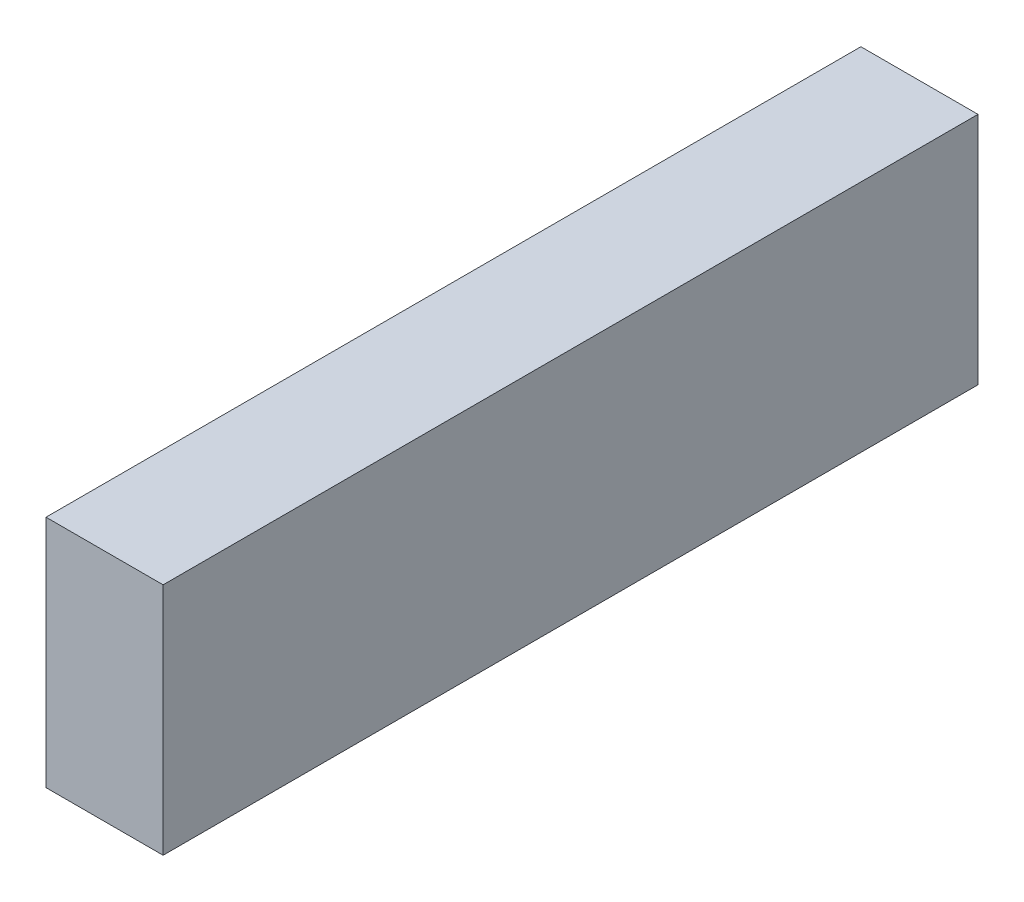
ISO-10303-21;
HEADER;
FILE_DESCRIPTION(('STEP AP214'),'2;1');
FILE_NAME('part.step','',(''),(''),'','','');
FILE_SCHEMA(('AUTOMOTIVE_DESIGN { 1 0 10303 214 1 1 1 1 }'));
ENDSEC;
DATA;
#1=APPLICATION_CONTEXT('core data for automotive mechanical design processes');
#2=APPLICATION_PROTOCOL_DEFINITION('international standard','automotive_design',2000,#1);
#3=PRODUCT_CONTEXT('',#1,'mechanical');
#4=PRODUCT('Part','Part','',(#3));
#5=PRODUCT_RELATED_PRODUCT_CATEGORY('part','',(#4));
#6=PRODUCT_DEFINITION_FORMATION('','',#4);
#7=PRODUCT_DEFINITION_CONTEXT('part definition',#1,'design');
#8=PRODUCT_DEFINITION('design','',#6,#7);
#9=PRODUCT_DEFINITION_SHAPE('','',#8);
#10=(LENGTH_UNIT() NAMED_UNIT(*) SI_UNIT(.MILLI.,.METRE.));
#11=(NAMED_UNIT(*) PLANE_ANGLE_UNIT() SI_UNIT($,.RADIAN.));
#12=(NAMED_UNIT(*) SI_UNIT($,.STERADIAN.) SOLID_ANGLE_UNIT());
#13=UNCERTAINTY_MEASURE_WITH_UNIT(LENGTH_MEASURE(1.E-05),#10,'distance_accuracy_value','');
#14=(GEOMETRIC_REPRESENTATION_CONTEXT(3) GLOBAL_UNCERTAINTY_ASSIGNED_CONTEXT((#13)) GLOBAL_UNIT_ASSIGNED_CONTEXT((#10,
#11,#12)) REPRESENTATION_CONTEXT('',''));
#15=CARTESIAN_POINT('',(0.,0.,0.));
#16=DIRECTION('',(0.,0.,1.));
#17=DIRECTION('',(1.,0.,0.));
#18=AXIS2_PLACEMENT_3D('',#15,#16,#17);
#19=CARTESIAN_POINT('',(-42.3,4.,6.91605351170569));
#20=DIRECTION('',(1.,0.,0.));
#21=DIRECTION('',(0.,0.,-1.));
#22=AXIS2_PLACEMENT_3D('',#19,#20,#21);
#23=PLANE('',#22);
#24=DIRECTION('',(0.,0.,1.));
#25=VECTOR('',#24,1.);
#26=CARTESIAN_POINT('',(-42.3,0.,6.91605351170569));
#27=LINE('',#26,#25);
#28=CARTESIAN_POINT('',(-42.3,0.,-7.));
#29=VERTEX_POINT('',#28);
#30=CARTESIAN_POINT('',(-42.3,0.,6.91605351170569));
#31=VERTEX_POINT('',#30);
#32=EDGE_CURVE('E105',#29,#31,#27,.T.);
#33=ORIENTED_EDGE('',*,*,#32,.T.);
#34=DIRECTION('',(0.,-1.,0.));
#35=VECTOR('',#34,1.);
#36=CARTESIAN_POINT('',(-42.3,4.,6.91605351170569));
#37=LINE('',#36,#35);
#38=CARTESIAN_POINT('',(-42.3,4.,6.91605351170569));
#39=VERTEX_POINT('',#38);
#40=EDGE_CURVE('E11',#39,#31,#37,.T.);
#41=ORIENTED_EDGE('',*,*,#40,.F.);
#42=DIRECTION('',(0.,0.,1.));
#43=VECTOR('',#42,1.);
#44=CARTESIAN_POINT('',(-42.3,4.,6.91605351170569));
#45=LINE('',#44,#43);
#46=CARTESIAN_POINT('',(-42.3,4.,-7.));
#47=VERTEX_POINT('',#46);
#48=EDGE_CURVE('E89',#47,#39,#45,.T.);
#49=ORIENTED_EDGE('',*,*,#48,.F.);
#50=DIRECTION('',(0.,-1.,0.));
#51=VECTOR('',#50,1.);
#52=CARTESIAN_POINT('',(-42.3,4.,-7.));
#53=LINE('',#52,#51);
#54=EDGE_CURVE('E98',#47,#29,#53,.T.);
#55=ORIENTED_EDGE('',*,*,#54,.T.);
#56=EDGE_LOOP('',(#33,#41,#49,#55));
#57=FACE_BOUND('',#56,.T.);
#58=ADVANCED_FACE('F39',(#57),#23,.F.);
#59=CARTESIAN_POINT('',(-42.3,4.,6.91605351170569));
#60=DIRECTION('',(0.,0.,-1.));
#61=DIRECTION('',(-1.,0.,0.));
#62=AXIS2_PLACEMENT_3D('',#59,#60,#61);
#63=PLANE('',#62);
#64=DIRECTION('',(1.,0.,0.));
#65=VECTOR('',#64,1.);
#66=CARTESIAN_POINT('',(-42.3,0.,6.91605351170569));
#67=LINE('',#66,#65);
#68=CARTESIAN_POINT('',(-40.3,0.,6.91605351170569));
#69=VERTEX_POINT('',#68);
#70=EDGE_CURVE('E94',#31,#69,#67,.T.);
#71=ORIENTED_EDGE('',*,*,#70,.T.);
#72=DIRECTION('',(0.,-1.,0.));
#73=VECTOR('',#72,1.);
#74=CARTESIAN_POINT('',(-40.3,4.,6.91605351170569));
#75=LINE('',#74,#73);
#76=CARTESIAN_POINT('',(-40.3,4.,6.91605351170569));
#77=VERTEX_POINT('',#76);
#78=EDGE_CURVE('E50',#77,#69,#75,.T.);
#79=ORIENTED_EDGE('',*,*,#78,.F.);
#80=DIRECTION('',(1.,0.,0.));
#81=VECTOR('',#80,1.);
#82=CARTESIAN_POINT('',(-42.3,4.,6.91605351170569));
#83=LINE('',#82,#81);
#84=EDGE_CURVE('E83',#39,#77,#83,.T.);
#85=ORIENTED_EDGE('',*,*,#84,.F.);
#86=ORIENTED_EDGE('',*,*,#40,.T.);
#87=EDGE_LOOP('',(#71,#79,#85,#86));
#88=FACE_BOUND('',#87,.T.);
#89=ADVANCED_FACE('F91',(#88),#63,.F.);
#90=CARTESIAN_POINT('',(-40.3,4.,6.91605351170569));
#91=DIRECTION('',(-1.,0.,0.));
#92=DIRECTION('',(0.,0.,1.));
#93=AXIS2_PLACEMENT_3D('',#90,#91,#92);
#94=PLANE('',#93);
#95=DIRECTION('',(0.,0.,-1.));
#96=VECTOR('',#95,1.);
#97=CARTESIAN_POINT('',(-40.3,0.,6.91605351170569));
#98=LINE('',#97,#96);
#99=CARTESIAN_POINT('',(-40.3,0.,-7.));
#100=VERTEX_POINT('',#99);
#101=EDGE_CURVE('E75',#69,#100,#98,.T.);
#102=ORIENTED_EDGE('',*,*,#101,.T.);
#103=DIRECTION('',(0.,-1.,0.));
#104=VECTOR('',#103,1.);
#105=CARTESIAN_POINT('',(-40.3,4.,-7.));
#106=LINE('',#105,#104);
#107=CARTESIAN_POINT('',(-40.3,4.,-7.));
#108=VERTEX_POINT('',#107);
#109=EDGE_CURVE('E92',#108,#100,#106,.T.);
#110=ORIENTED_EDGE('',*,*,#109,.F.);
#111=DIRECTION('',(0.,0.,-1.));
#112=VECTOR('',#111,1.);
#113=CARTESIAN_POINT('',(-40.3,4.,6.91605351170569));
#114=LINE('',#113,#112);
#115=EDGE_CURVE('E86',#77,#108,#114,.T.);
#116=ORIENTED_EDGE('',*,*,#115,.F.);
#117=ORIENTED_EDGE('',*,*,#78,.T.);
#118=EDGE_LOOP('',(#102,#110,#116,#117));
#119=FACE_BOUND('',#118,.T.);
#120=ADVANCED_FACE('F96',(#119),#94,.F.);
#121=CARTESIAN_POINT('',(-42.3,4.,-7.));
#122=DIRECTION('',(0.,0.,1.));
#123=DIRECTION('',(1.,0.,0.));
#124=AXIS2_PLACEMENT_3D('',#121,#122,#123);
#125=PLANE('',#124);
#126=DIRECTION('',(-1.,0.,0.));
#127=VECTOR('',#126,1.);
#128=CARTESIAN_POINT('',(-42.3,0.,-7.));
#129=LINE('',#128,#127);
#130=EDGE_CURVE('E77',#100,#29,#129,.T.);
#131=ORIENTED_EDGE('',*,*,#130,.T.);
#132=ORIENTED_EDGE('',*,*,#54,.F.);
#133=DIRECTION('',(-1.,0.,0.));
#134=VECTOR('',#133,1.);
#135=CARTESIAN_POINT('',(-42.3,4.,-7.));
#136=LINE('',#135,#134);
#137=EDGE_CURVE('E54',#108,#47,#136,.T.);
#138=ORIENTED_EDGE('',*,*,#137,.F.);
#139=ORIENTED_EDGE('',*,*,#109,.T.);
#140=EDGE_LOOP('',(#131,#132,#138,#139));
#141=FACE_BOUND('',#140,.T.);
#142=ADVANCED_FACE('F108',(#141),#125,.F.);
#143=CARTESIAN_POINT('',(0.,4.,0.));
#144=DIRECTION('',(0.,-1.,0.));
#145=DIRECTION('',(0.,0.,-1.));
#146=AXIS2_PLACEMENT_3D('',#143,#144,#145);
#147=PLANE('',#146);
#148=ORIENTED_EDGE('',*,*,#48,.T.);
#149=ORIENTED_EDGE('',*,*,#84,.T.);
#150=ORIENTED_EDGE('',*,*,#115,.T.);
#151=ORIENTED_EDGE('',*,*,#137,.T.);
#152=EDGE_LOOP('',(#148,#149,#150,#151));
#153=FACE_BOUND('',#152,.T.);
#154=ADVANCED_FACE('F88',(#153),#147,.F.);
#155=CARTESIAN_POINT('',(0.,0.,0.));
#156=DIRECTION('',(0.,-1.,0.));
#157=DIRECTION('',(0.,0.,-1.));
#158=AXIS2_PLACEMENT_3D('',#155,#156,#157);
#159=PLANE('',#158);
#160=ORIENTED_EDGE('',*,*,#32,.F.);
#161=ORIENTED_EDGE('',*,*,#130,.F.);
#162=ORIENTED_EDGE('',*,*,#101,.F.);
#163=ORIENTED_EDGE('',*,*,#70,.F.);
#164=EDGE_LOOP('',(#160,#161,#162,#163));
#165=FACE_BOUND('',#164,.T.);
#166=ADVANCED_FACE('F115',(#165),#159,.T.);
#167=CLOSED_SHELL('',(#58,#89,#120,#142,#154,#166));
#168=MANIFOLD_SOLID_BREP('B2',#167);
#169=ADVANCED_BREP_SHAPE_REPRESENTATION('',(#18,#168),#14);
#170=SHAPE_DEFINITION_REPRESENTATION(#9,#169);
ENDSEC;
END-ISO-10303-21;
